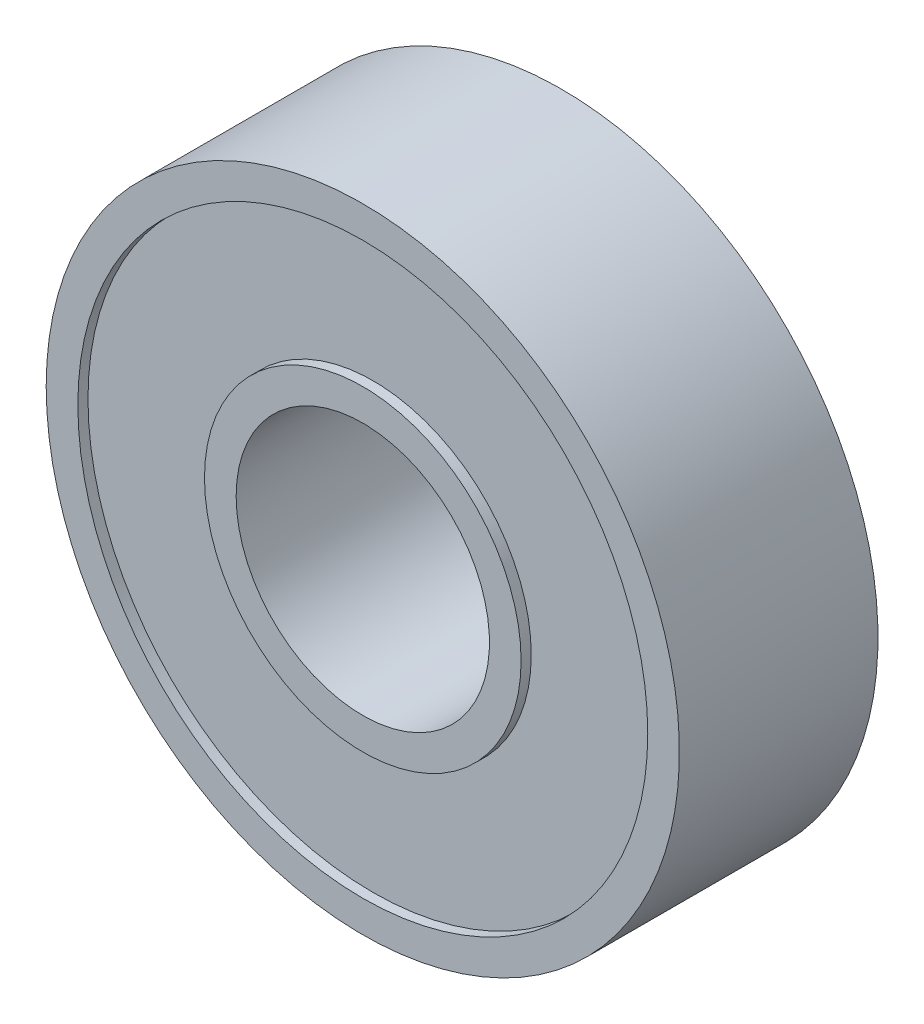
ISO-10303-21;
HEADER;
FILE_DESCRIPTION(('STEP AP214'),'2;1');
FILE_NAME('part.step','',(''),(''),'','','');
FILE_SCHEMA(('AUTOMOTIVE_DESIGN { 1 0 10303 214 1 1 1 1 }'));
ENDSEC;
DATA;
#1=APPLICATION_CONTEXT('core data for automotive mechanical design processes');
#2=APPLICATION_PROTOCOL_DEFINITION('international standard','automotive_design',2000,#1);
#3=PRODUCT_CONTEXT('',#1,'mechanical');
#4=PRODUCT('Part','Part','',(#3));
#5=PRODUCT_RELATED_PRODUCT_CATEGORY('part','',(#4));
#6=PRODUCT_DEFINITION_FORMATION('','',#4);
#7=PRODUCT_DEFINITION_CONTEXT('part definition',#1,'design');
#8=PRODUCT_DEFINITION('design','',#6,#7);
#9=PRODUCT_DEFINITION_SHAPE('','',#8);
#10=(LENGTH_UNIT() NAMED_UNIT(*) SI_UNIT(.MILLI.,.METRE.));
#11=(NAMED_UNIT(*) PLANE_ANGLE_UNIT() SI_UNIT($,.RADIAN.));
#12=(NAMED_UNIT(*) SI_UNIT($,.STERADIAN.) SOLID_ANGLE_UNIT());
#13=UNCERTAINTY_MEASURE_WITH_UNIT(LENGTH_MEASURE(1.E-05),#10,'distance_accuracy_value','');
#14=(GEOMETRIC_REPRESENTATION_CONTEXT(3) GLOBAL_UNCERTAINTY_ASSIGNED_CONTEXT((#13)) GLOBAL_UNIT_ASSIGNED_CONTEXT((#10,
#11,#12)) REPRESENTATION_CONTEXT('',''));
#15=CARTESIAN_POINT('',(0.,0.,0.));
#16=DIRECTION('',(0.,0.,1.));
#17=DIRECTION('',(1.,0.,0.));
#18=AXIS2_PLACEMENT_3D('',#15,#16,#17);
#19=CARTESIAN_POINT('',(0.,0.,-2.4892));
#20=DIRECTION('',(0.,0.,-1.));
#21=DIRECTION('',(-1.,0.,0.));
#22=AXIS2_PLACEMENT_3D('',#19,#20,#21);
#23=CYLINDRICAL_SURFACE('',#22,3.175);
#24=CARTESIAN_POINT('',(0.,0.,2.4892));
#25=DIRECTION('',(0.,0.,-1.));
#26=DIRECTION('',(-1.,0.,0.));
#27=AXIS2_PLACEMENT_3D('',#24,#25,#26);
#28=CIRCLE('',#27,3.175);
#29=CARTESIAN_POINT('',(-3.17499999999999,0.,2.4892));
#30=VERTEX_POINT('',#29);
#31=EDGE_CURVE('E18',#30,#30,#28,.F.);
#32=ORIENTED_EDGE('',*,*,#31,.T.);
#33=EDGE_LOOP('',(#32));
#34=FACE_BOUND('',#33,.T.);
#35=CARTESIAN_POINT('',(0.,0.,-2.4892));
#36=DIRECTION('',(0.,0.,-1.));
#37=DIRECTION('',(-1.,0.,0.));
#38=AXIS2_PLACEMENT_3D('',#35,#36,#37);
#39=CIRCLE('',#38,3.175);
#40=CARTESIAN_POINT('',(-3.175,0.,-2.4892));
#41=VERTEX_POINT('',#40);
#42=EDGE_CURVE('E52',#41,#41,#39,.T.);
#43=ORIENTED_EDGE('',*,*,#42,.T.);
#44=EDGE_LOOP('',(#43));
#45=FACE_BOUND('',#44,.T.);
#46=ADVANCED_FACE('F15',(#34,#45),#23,.F.);
#47=CARTESIAN_POINT('',(3.175,0.,2.4892));
#48=DIRECTION('',(0.,0.,-1.));
#49=DIRECTION('',(-1.,0.,0.));
#50=AXIS2_PLACEMENT_3D('',#47,#48,#49);
#51=PLANE('',#50);
#52=ORIENTED_EDGE('',*,*,#31,.F.);
#53=EDGE_LOOP('',(#52));
#54=FACE_BOUND('',#53,.T.);
#55=CARTESIAN_POINT('',(0.,0.,2.4892));
#56=DIRECTION('',(0.,0.,-1.));
#57=DIRECTION('',(-1.,0.,0.));
#58=AXIS2_PLACEMENT_3D('',#55,#56,#57);
#59=CIRCLE('',#58,3.96875);
#60=CARTESIAN_POINT('',(-3.96874999999999,0.,2.4892));
#61=VERTEX_POINT('',#60);
#62=EDGE_CURVE('E50',#61,#61,#59,.T.);
#63=ORIENTED_EDGE('',*,*,#62,.F.);
#64=EDGE_LOOP('',(#63));
#65=FACE_BOUND('',#64,.T.);
#66=ADVANCED_FACE('F60',(#54,#65),#51,.F.);
#67=CARTESIAN_POINT('',(3.96875,0.,-2.4892));
#68=DIRECTION('',(0.,0.,1.));
#69=DIRECTION('',(1.,0.,0.));
#70=AXIS2_PLACEMENT_3D('',#67,#68,#69);
#71=PLANE('',#70);
#72=CARTESIAN_POINT('',(0.,0.,-2.4892));
#73=DIRECTION('',(0.,0.,-1.));
#74=DIRECTION('',(-1.,0.,0.));
#75=AXIS2_PLACEMENT_3D('',#72,#73,#74);
#76=CIRCLE('',#75,3.96875);
#77=CARTESIAN_POINT('',(-3.96875,0.,-2.4892));
#78=VERTEX_POINT('',#77);
#79=EDGE_CURVE('E47',#78,#78,#76,.F.);
#80=ORIENTED_EDGE('',*,*,#79,.F.);
#81=EDGE_LOOP('',(#80));
#82=FACE_BOUND('',#81,.T.);
#83=ORIENTED_EDGE('',*,*,#42,.F.);
#84=EDGE_LOOP('',(#83));
#85=FACE_BOUND('',#84,.T.);
#86=ADVANCED_FACE('F63',(#82,#85),#71,.F.);
#87=CARTESIAN_POINT('',(0.,0.,-2.4892));
#88=DIRECTION('',(0.,0.,-1.));
#89=DIRECTION('',(-1.,0.,0.));
#90=AXIS2_PLACEMENT_3D('',#87,#88,#89);
#91=CYLINDRICAL_SURFACE('',#90,3.96875);
#92=CARTESIAN_POINT('',(0.,0.,2.23519999999999));
#93=DIRECTION('',(0.,0.,-1.));
#94=DIRECTION('',(-1.,0.,0.));
#95=AXIS2_PLACEMENT_3D('',#92,#93,#94);
#96=CIRCLE('',#95,3.96875);
#97=CARTESIAN_POINT('',(-3.96874999999999,0.,2.2352));
#98=VERTEX_POINT('',#97);
#99=EDGE_CURVE('E44',#98,#98,#96,.F.);
#100=ORIENTED_EDGE('',*,*,#99,.T.);
#101=EDGE_LOOP('',(#100));
#102=FACE_BOUND('',#101,.T.);
#103=ORIENTED_EDGE('',*,*,#62,.T.);
#104=EDGE_LOOP('',(#103));
#105=FACE_BOUND('',#104,.T.);
#106=ADVANCED_FACE('F66',(#102,#105),#91,.T.);
#107=CARTESIAN_POINT('',(0.,0.,-2.4892));
#108=DIRECTION('',(0.,0.,-1.));
#109=DIRECTION('',(-1.,0.,0.));
#110=AXIS2_PLACEMENT_3D('',#107,#108,#109);
#111=CYLINDRICAL_SURFACE('',#110,3.96875);
#112=ORIENTED_EDGE('',*,*,#79,.T.);
#113=EDGE_LOOP('',(#112));
#114=FACE_BOUND('',#113,.T.);
#115=CARTESIAN_POINT('',(0.,0.,-2.23519999999999));
#116=DIRECTION('',(0.,0.,-1.));
#117=DIRECTION('',(-1.,0.,0.));
#118=AXIS2_PLACEMENT_3D('',#115,#116,#117);
#119=CIRCLE('',#118,3.96875);
#120=CARTESIAN_POINT('',(-3.96875,0.,-2.23519999999999));
#121=VERTEX_POINT('',#120);
#122=EDGE_CURVE('E41',#121,#121,#119,.T.);
#123=ORIENTED_EDGE('',*,*,#122,.T.);
#124=EDGE_LOOP('',(#123));
#125=FACE_BOUND('',#124,.T.);
#126=ADVANCED_FACE('F68',(#114,#125),#111,.T.);
#127=CARTESIAN_POINT('',(3.96875,0.,2.23519999999999));
#128=DIRECTION('',(0.,0.,-1.));
#129=DIRECTION('',(-1.,0.,0.));
#130=AXIS2_PLACEMENT_3D('',#127,#128,#129);
#131=PLANE('',#130);
#132=ORIENTED_EDGE('',*,*,#99,.F.);
#133=EDGE_LOOP('',(#132));
#134=FACE_BOUND('',#133,.T.);
#135=CARTESIAN_POINT('',(0.,0.,2.2352));
#136=DIRECTION('',(0.,0.,-1.));
#137=DIRECTION('',(-1.,0.,0.));
#138=AXIS2_PLACEMENT_3D('',#135,#136,#137);
#139=CIRCLE('',#138,7.14375);
#140=CARTESIAN_POINT('',(-7.14374999999999,0.,2.2352));
#141=VERTEX_POINT('',#140);
#142=EDGE_CURVE('E38',#141,#141,#139,.F.);
#143=ORIENTED_EDGE('',*,*,#142,.T.);
#144=EDGE_LOOP('',(#143));
#145=FACE_BOUND('',#144,.T.);
#146=ADVANCED_FACE('F76',(#134,#145),#131,.F.);
#147=CARTESIAN_POINT('',(7.14375,0.,-2.2352));
#148=DIRECTION('',(0.,0.,1.));
#149=DIRECTION('',(1.,0.,0.));
#150=AXIS2_PLACEMENT_3D('',#147,#148,#149);
#151=PLANE('',#150);
#152=CARTESIAN_POINT('',(0.,0.,-2.23519999999999));
#153=DIRECTION('',(0.,0.,-1.));
#154=DIRECTION('',(-1.,0.,0.));
#155=AXIS2_PLACEMENT_3D('',#152,#153,#154);
#156=CIRCLE('',#155,7.14375);
#157=CARTESIAN_POINT('',(-7.14375,0.,-2.23519999999999));
#158=VERTEX_POINT('',#157);
#159=EDGE_CURVE('E35',#158,#158,#156,.T.);
#160=ORIENTED_EDGE('',*,*,#159,.T.);
#161=EDGE_LOOP('',(#160));
#162=FACE_BOUND('',#161,.T.);
#163=ORIENTED_EDGE('',*,*,#122,.F.);
#164=EDGE_LOOP('',(#163));
#165=FACE_BOUND('',#164,.T.);
#166=ADVANCED_FACE('F103',(#162,#165),#151,.F.);
#167=CARTESIAN_POINT('',(0.,0.,-2.4892));
#168=DIRECTION('',(0.,0.,-1.));
#169=DIRECTION('',(-1.,0.,0.));
#170=AXIS2_PLACEMENT_3D('',#167,#168,#169);
#171=CYLINDRICAL_SURFACE('',#170,7.14375);
#172=CARTESIAN_POINT('',(0.,0.,2.4892));
#173=DIRECTION('',(0.,0.,-1.));
#174=DIRECTION('',(-1.,0.,0.));
#175=AXIS2_PLACEMENT_3D('',#172,#173,#174);
#176=CIRCLE('',#175,7.14375);
#177=CARTESIAN_POINT('',(-7.14374999999999,0.,2.4892));
#178=VERTEX_POINT('',#177);
#179=EDGE_CURVE('E32',#178,#178,#176,.F.);
#180=ORIENTED_EDGE('',*,*,#179,.T.);
#181=EDGE_LOOP('',(#180));
#182=FACE_BOUND('',#181,.T.);
#183=ORIENTED_EDGE('',*,*,#142,.F.);
#184=EDGE_LOOP('',(#183));
#185=FACE_BOUND('',#184,.T.);
#186=ADVANCED_FACE('F99',(#182,#185),#171,.F.);
#187=CARTESIAN_POINT('',(0.,0.,-2.4892));
#188=DIRECTION('',(0.,0.,-1.));
#189=DIRECTION('',(-1.,0.,0.));
#190=AXIS2_PLACEMENT_3D('',#187,#188,#189);
#191=CYLINDRICAL_SURFACE('',#190,7.14375);
#192=ORIENTED_EDGE('',*,*,#159,.F.);
#193=EDGE_LOOP('',(#192));
#194=FACE_BOUND('',#193,.T.);
#195=CARTESIAN_POINT('',(0.,0.,-2.4892));
#196=DIRECTION('',(0.,0.,-1.));
#197=DIRECTION('',(-1.,0.,0.));
#198=AXIS2_PLACEMENT_3D('',#195,#196,#197);
#199=CIRCLE('',#198,7.14375);
#200=CARTESIAN_POINT('',(-7.14375,0.,-2.4892));
#201=VERTEX_POINT('',#200);
#202=EDGE_CURVE('E27',#201,#201,#199,.T.);
#203=ORIENTED_EDGE('',*,*,#202,.T.);
#204=EDGE_LOOP('',(#203));
#205=FACE_BOUND('',#204,.T.);
#206=ADVANCED_FACE('F95',(#194,#205),#191,.F.);
#207=CARTESIAN_POINT('',(7.14375,0.,2.4892));
#208=DIRECTION('',(0.,0.,-1.));
#209=DIRECTION('',(-1.,0.,0.));
#210=AXIS2_PLACEMENT_3D('',#207,#208,#209);
#211=PLANE('',#210);
#212=ORIENTED_EDGE('',*,*,#179,.F.);
#213=EDGE_LOOP('',(#212));
#214=FACE_BOUND('',#213,.T.);
#215=CARTESIAN_POINT('',(0.,0.,2.4892));
#216=DIRECTION('',(0.,0.,-1.));
#217=DIRECTION('',(-1.,0.,0.));
#218=AXIS2_PLACEMENT_3D('',#215,#216,#217);
#219=CIRCLE('',#218,7.93749999999999);
#220=CARTESIAN_POINT('',(-7.93749999999999,0.,2.4892));
#221=VERTEX_POINT('',#220);
#222=EDGE_CURVE('E22',#221,#221,#219,.T.);
#223=ORIENTED_EDGE('',*,*,#222,.F.);
#224=EDGE_LOOP('',(#223));
#225=FACE_BOUND('',#224,.T.);
#226=ADVANCED_FACE('F88',(#214,#225),#211,.F.);
#227=CARTESIAN_POINT('',(7.93749999999999,0.,-2.4892));
#228=DIRECTION('',(0.,0.,1.));
#229=DIRECTION('',(1.,0.,0.));
#230=AXIS2_PLACEMENT_3D('',#227,#228,#229);
#231=PLANE('',#230);
#232=CARTESIAN_POINT('',(0.,0.,-2.4892));
#233=DIRECTION('',(0.,0.,-1.));
#234=DIRECTION('',(-1.,0.,0.));
#235=AXIS2_PLACEMENT_3D('',#232,#233,#234);
#236=CIRCLE('',#235,7.93749999999999);
#237=CARTESIAN_POINT('',(-7.93749999999999,0.,-2.4892));
#238=VERTEX_POINT('',#237);
#239=EDGE_CURVE('E10',#238,#238,#236,.F.);
#240=ORIENTED_EDGE('',*,*,#239,.F.);
#241=EDGE_LOOP('',(#240));
#242=FACE_BOUND('',#241,.T.);
#243=ORIENTED_EDGE('',*,*,#202,.F.);
#244=EDGE_LOOP('',(#243));
#245=FACE_BOUND('',#244,.T.);
#246=ADVANCED_FACE('F83',(#242,#245),#231,.F.);
#247=CARTESIAN_POINT('',(0.,0.,-2.4892));
#248=DIRECTION('',(0.,0.,-1.));
#249=DIRECTION('',(-1.,0.,0.));
#250=AXIS2_PLACEMENT_3D('',#247,#248,#249);
#251=CYLINDRICAL_SURFACE('',#250,7.93749999999999);
#252=ORIENTED_EDGE('',*,*,#239,.T.);
#253=EDGE_LOOP('',(#252));
#254=FACE_BOUND('',#253,.T.);
#255=ORIENTED_EDGE('',*,*,#222,.T.);
#256=EDGE_LOOP('',(#255));
#257=FACE_BOUND('',#256,.T.);
#258=ADVANCED_FACE('F81',(#254,#257),#251,.T.);
#259=CLOSED_SHELL('',(#46,#66,#86,#106,#126,#146,#166,#186,#206,#226,#246,#258));
#260=MANIFOLD_SOLID_BREP('B1',#259);
#261=ADVANCED_BREP_SHAPE_REPRESENTATION('',(#18,#260),#14);
#262=SHAPE_DEFINITION_REPRESENTATION(#9,#261);
ENDSEC;
END-ISO-10303-21;
